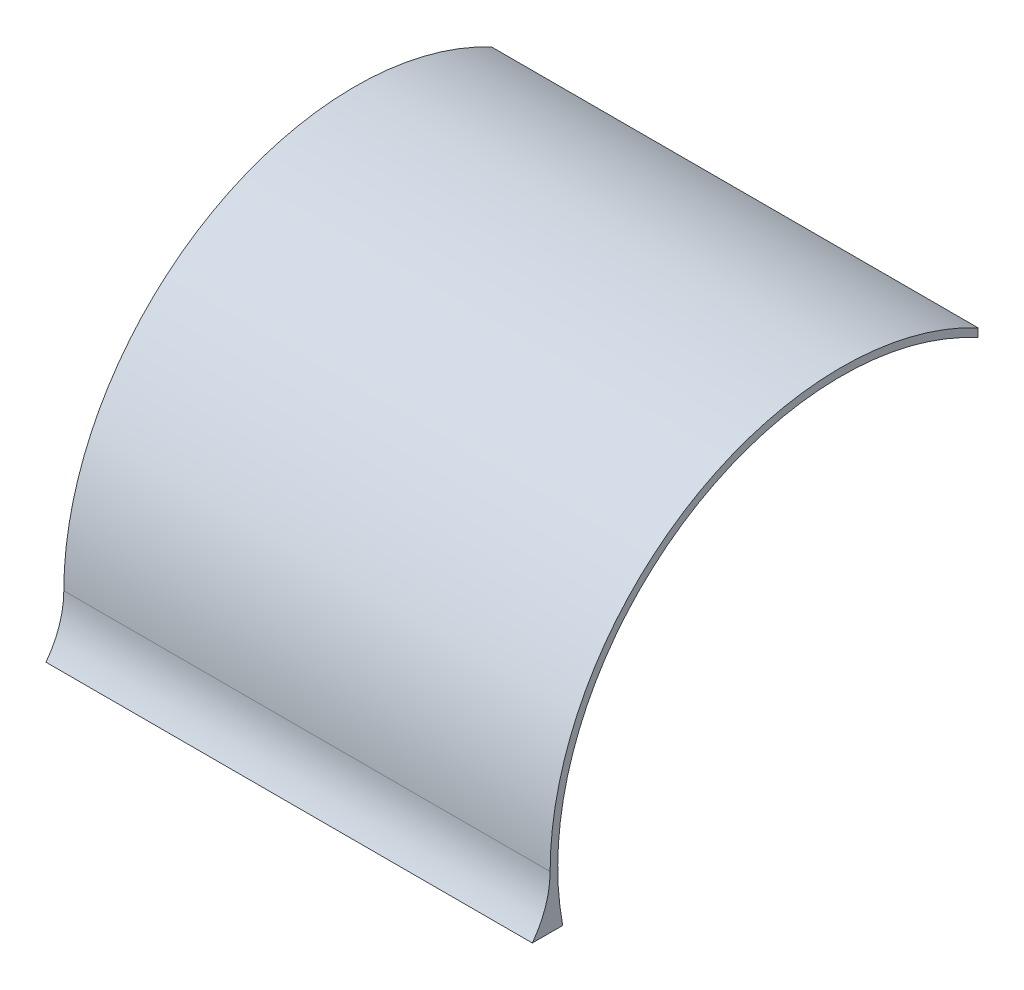
ISO-10303-21;
HEADER;
FILE_DESCRIPTION(('STEP AP214'),'2;1');
FILE_NAME('part.step','',(''),(''),'','','');
FILE_SCHEMA(('AUTOMOTIVE_DESIGN { 1 0 10303 214 1 1 1 1 }'));
ENDSEC;
DATA;
#1=APPLICATION_CONTEXT('core data for automotive mechanical design processes');
#2=APPLICATION_PROTOCOL_DEFINITION('international standard','automotive_design',2000,#1);
#3=PRODUCT_CONTEXT('',#1,'mechanical');
#4=PRODUCT('Part','Part','',(#3));
#5=PRODUCT_RELATED_PRODUCT_CATEGORY('part','',(#4));
#6=PRODUCT_DEFINITION_FORMATION('','',#4);
#7=PRODUCT_DEFINITION_CONTEXT('part definition',#1,'design');
#8=PRODUCT_DEFINITION('design','',#6,#7);
#9=PRODUCT_DEFINITION_SHAPE('','',#8);
#10=(LENGTH_UNIT() NAMED_UNIT(*) SI_UNIT(.MILLI.,.METRE.));
#11=(NAMED_UNIT(*) PLANE_ANGLE_UNIT() SI_UNIT($,.RADIAN.));
#12=(NAMED_UNIT(*) SI_UNIT($,.STERADIAN.) SOLID_ANGLE_UNIT());
#13=UNCERTAINTY_MEASURE_WITH_UNIT(LENGTH_MEASURE(1.E-05),#10,'distance_accuracy_value','');
#14=(GEOMETRIC_REPRESENTATION_CONTEXT(3) GLOBAL_UNCERTAINTY_ASSIGNED_CONTEXT((#13)) GLOBAL_UNIT_ASSIGNED_CONTEXT((#10,
#11,#12)) REPRESENTATION_CONTEXT('',''));
#15=CARTESIAN_POINT('',(0.,0.,0.));
#16=DIRECTION('',(0.,0.,1.));
#17=DIRECTION('',(1.,0.,0.));
#18=AXIS2_PLACEMENT_3D('',#15,#16,#17);
#19=CARTESIAN_POINT('',(160.,1.09833087701214E-13,-45.0000000000002));
#20=DIRECTION('',(0.,0.,-1.));
#21=DIRECTION('',(0.,1.,0.));
#22=AXIS2_PLACEMENT_3D('',#19,#20,#21);
#23=PLANE('',#22);
#24=DIRECTION('',(0.,-1.,0.));
#25=VECTOR('',#24,1.);
#26=CARTESIAN_POINT('',(0.,1.09833087701214E-13,-45.0000000000002));
#27=LINE('',#26,#25);
#28=CARTESIAN_POINT('',(0.,84.5392979625452,-45.));
#29=VERTEX_POINT('',#28);
#30=CARTESIAN_POINT('',(0.,81.6963456955083,-45.));
#31=VERTEX_POINT('',#30);
#32=EDGE_CURVE('E110',#29,#31,#27,.T.);
#33=ORIENTED_EDGE('',*,*,#32,.F.);
#34=DIRECTION('',(-1.,0.,0.));
#35=VECTOR('',#34,1.);
#36=CARTESIAN_POINT('',(160.,84.5392979625452,-45.));
#37=LINE('',#36,#35);
#38=CARTESIAN_POINT('',(160.,84.5392979625452,-45.));
#39=VERTEX_POINT('',#38);
#40=EDGE_CURVE('E11',#39,#29,#37,.T.);
#41=ORIENTED_EDGE('',*,*,#40,.F.);
#42=DIRECTION('',(0.,-1.,0.));
#43=VECTOR('',#42,1.);
#44=CARTESIAN_POINT('',(160.,1.09833087701214E-13,-45.0000000000002));
#45=LINE('',#44,#43);
#46=CARTESIAN_POINT('',(160.,81.6963456955083,-45.));
#47=VERTEX_POINT('',#46);
#48=EDGE_CURVE('E112',#39,#47,#45,.T.);
#49=ORIENTED_EDGE('',*,*,#48,.T.);
#50=DIRECTION('',(-1.,0.,0.));
#51=VECTOR('',#50,1.);
#52=CARTESIAN_POINT('',(160.,81.6963456955083,-45.));
#53=LINE('',#52,#51);
#54=EDGE_CURVE('E121',#47,#31,#53,.T.);
#55=ORIENTED_EDGE('',*,*,#54,.T.);
#56=EDGE_LOOP('',(#33,#41,#49,#55));
#57=FACE_BOUND('',#56,.T.);
#58=ADVANCED_FACE('F41',(#57),#23,.T.);
#59=CARTESIAN_POINT('',(160.,0.,0.));
#60=DIRECTION('',(-1.,0.,0.));
#61=DIRECTION('',(0.,0.,1.));
#62=AXIS2_PLACEMENT_3D('',#59,#60,#61);
#63=CYLINDRICAL_SURFACE('',#62,95.77);
#64=CARTESIAN_POINT('',(0.,0.,0.));
#65=DIRECTION('',(1.,0.,0.));
#66=DIRECTION('',(0.,0.,-1.));
#67=AXIS2_PLACEMENT_3D('',#64,#65,#66);
#68=CIRCLE('',#67,95.77);
#69=CARTESIAN_POINT('',(0.,0.,95.77));
#70=VERTEX_POINT('',#69);
#71=EDGE_CURVE('E59',#29,#70,#68,.T.);
#72=ORIENTED_EDGE('',*,*,#71,.T.);
#73=DIRECTION('',(1.,0.,0.));
#74=VECTOR('',#73,1.);
#75=CARTESIAN_POINT('',(0.,0.,95.77));
#76=LINE('',#75,#74);
#77=CARTESIAN_POINT('',(160.,0.,95.77));
#78=VERTEX_POINT('',#77);
#79=EDGE_CURVE('E55',#70,#78,#76,.T.);
#80=ORIENTED_EDGE('',*,*,#79,.T.);
#81=CARTESIAN_POINT('',(160.,0.,0.));
#82=DIRECTION('',(1.,0.,0.));
#83=DIRECTION('',(0.,0.,-1.));
#84=AXIS2_PLACEMENT_3D('',#81,#82,#83);
#85=CIRCLE('',#84,95.77);
#86=EDGE_CURVE('E115',#39,#78,#85,.T.);
#87=ORIENTED_EDGE('',*,*,#86,.F.);
#88=ORIENTED_EDGE('',*,*,#40,.T.);
#89=EDGE_LOOP('',(#72,#80,#87,#88));
#90=FACE_BOUND('',#89,.T.);
#91=ADVANCED_FACE('F131',(#90),#63,.T.);
#92=CARTESIAN_POINT('',(160.,-17.44,0.));
#93=DIRECTION('',(0.,1.,0.));
#94=DIRECTION('',(0.,0.,1.));
#95=AXIS2_PLACEMENT_3D('',#92,#93,#94);
#96=PLANE('',#95);
#97=DIRECTION('',(0.,0.,-1.));
#98=VECTOR('',#97,1.);
#99=CARTESIAN_POINT('',(0.,-17.44,0.));
#100=LINE('',#99,#98);
#101=CARTESIAN_POINT('',(0.,-17.44,101.62499276944));
#102=VERTEX_POINT('',#101);
#103=CARTESIAN_POINT('',(0.,-17.44,91.6249927694404));
#104=VERTEX_POINT('',#103);
#105=EDGE_CURVE('E86',#102,#104,#100,.T.);
#106=ORIENTED_EDGE('',*,*,#105,.T.);
#107=DIRECTION('',(-1.,0.,0.));
#108=VECTOR('',#107,1.);
#109=CARTESIAN_POINT('',(160.,-17.44,91.6249927694404));
#110=LINE('',#109,#108);
#111=CARTESIAN_POINT('',(160.,-17.44,91.6249927694404));
#112=VERTEX_POINT('',#111);
#113=EDGE_CURVE('E48',#112,#104,#110,.T.);
#114=ORIENTED_EDGE('',*,*,#113,.F.);
#115=DIRECTION('',(0.,0.,-1.));
#116=VECTOR('',#115,1.);
#117=CARTESIAN_POINT('',(160.,-17.44,0.));
#118=LINE('',#117,#116);
#119=CARTESIAN_POINT('',(160.,-17.44,101.62499276944));
#120=VERTEX_POINT('',#119);
#121=EDGE_CURVE('E100',#120,#112,#118,.T.);
#122=ORIENTED_EDGE('',*,*,#121,.F.);
#123=DIRECTION('',(1.,0.,0.));
#124=VECTOR('',#123,1.);
#125=CARTESIAN_POINT('',(0.,-17.44,101.62499276944));
#126=LINE('',#125,#124);
#127=EDGE_CURVE('E98',#102,#120,#126,.T.);
#128=ORIENTED_EDGE('',*,*,#127,.F.);
#129=EDGE_LOOP('',(#106,#114,#122,#128));
#130=FACE_BOUND('',#129,.T.);
#131=ADVANCED_FACE('F99',(#130),#96,.F.);
#132=CARTESIAN_POINT('',(160.,0.,0.));
#133=DIRECTION('',(-1.,0.,0.));
#134=DIRECTION('',(0.,0.,1.));
#135=AXIS2_PLACEMENT_3D('',#132,#133,#134);
#136=CYLINDRICAL_SURFACE('',#135,93.27);
#137=CARTESIAN_POINT('',(0.,0.,0.));
#138=DIRECTION('',(1.,0.,0.));
#139=DIRECTION('',(0.,0.,-1.));
#140=AXIS2_PLACEMENT_3D('',#137,#138,#139);
#141=CIRCLE('',#140,93.27);
#142=EDGE_CURVE('E93',#31,#104,#141,.T.);
#143=ORIENTED_EDGE('',*,*,#142,.F.);
#144=ORIENTED_EDGE('',*,*,#54,.F.);
#145=CARTESIAN_POINT('',(160.,0.,0.));
#146=DIRECTION('',(1.,0.,0.));
#147=DIRECTION('',(0.,0.,-1.));
#148=AXIS2_PLACEMENT_3D('',#145,#146,#147);
#149=CIRCLE('',#148,93.27);
#150=EDGE_CURVE('E118',#47,#112,#149,.T.);
#151=ORIENTED_EDGE('',*,*,#150,.T.);
#152=ORIENTED_EDGE('',*,*,#113,.T.);
#153=EDGE_LOOP('',(#143,#144,#151,#152));
#154=FACE_BOUND('',#153,.T.);
#155=ADVANCED_FACE('F126',(#154),#136,.F.);
#156=CARTESIAN_POINT('',(160.,0.,0.));
#157=DIRECTION('',(1.,0.,0.));
#158=DIRECTION('',(0.,0.,-1.));
#159=AXIS2_PLACEMENT_3D('',#156,#157,#158);
#160=PLANE('',#159);
#161=ORIENTED_EDGE('',*,*,#48,.F.);
#162=ORIENTED_EDGE('',*,*,#86,.T.);
#163=CARTESIAN_POINT('',(160.,7.10369263412503E-13,124.671362790459));
#164=DIRECTION('',(-1.,0.,0.));
#165=DIRECTION('',(0.,0.,1.));
#166=AXIS2_PLACEMENT_3D('',#163,#164,#165);
#167=CIRCLE('',#166,28.9013627904593);
#168=EDGE_CURVE('E106',#78,#120,#167,.T.);
#169=ORIENTED_EDGE('',*,*,#168,.T.);
#170=ORIENTED_EDGE('',*,*,#121,.T.);
#171=ORIENTED_EDGE('',*,*,#150,.F.);
#172=EDGE_LOOP('',(#161,#162,#169,#170,#171));
#173=FACE_BOUND('',#172,.T.);
#174=ADVANCED_FACE('F130',(#173),#160,.T.);
#175=CARTESIAN_POINT('',(0.,0.,0.));
#176=DIRECTION('',(1.,0.,0.));
#177=DIRECTION('',(0.,0.,-1.));
#178=AXIS2_PLACEMENT_3D('',#175,#176,#177);
#179=PLANE('',#178);
#180=ORIENTED_EDGE('',*,*,#32,.T.);
#181=ORIENTED_EDGE('',*,*,#142,.T.);
#182=ORIENTED_EDGE('',*,*,#105,.F.);
#183=CARTESIAN_POINT('',(0.,7.10369263412503E-13,124.671362790459));
#184=DIRECTION('',(-1.,0.,0.));
#185=DIRECTION('',(0.,0.,1.));
#186=AXIS2_PLACEMENT_3D('',#183,#184,#185);
#187=CIRCLE('',#186,28.9013627904593);
#188=EDGE_CURVE('E91',#70,#102,#187,.T.);
#189=ORIENTED_EDGE('',*,*,#188,.F.);
#190=ORIENTED_EDGE('',*,*,#71,.F.);
#191=EDGE_LOOP('',(#180,#181,#182,#189,#190));
#192=FACE_BOUND('',#191,.T.);
#193=ADVANCED_FACE('F89',(#192),#179,.F.);
#194=CARTESIAN_POINT('',(0.,7.10369263412503E-13,124.671362790459));
#195=DIRECTION('',(1.,0.,0.));
#196=DIRECTION('',(0.,0.,-1.));
#197=AXIS2_PLACEMENT_3D('',#194,#195,#196);
#198=CYLINDRICAL_SURFACE('',#197,28.9013627904593);
#199=ORIENTED_EDGE('',*,*,#168,.F.);
#200=ORIENTED_EDGE('',*,*,#79,.F.);
#201=ORIENTED_EDGE('',*,*,#188,.T.);
#202=ORIENTED_EDGE('',*,*,#127,.T.);
#203=EDGE_LOOP('',(#199,#200,#201,#202));
#204=FACE_BOUND('',#203,.T.);
#205=ADVANCED_FACE('F105',(#204),#198,.F.);
#206=CLOSED_SHELL('',(#58,#91,#131,#155,#174,#193,#205));
#207=MANIFOLD_SOLID_BREP('B2',#206);
#208=ADVANCED_BREP_SHAPE_REPRESENTATION('',(#18,#207),#14);
#209=SHAPE_DEFINITION_REPRESENTATION(#9,#208);
ENDSEC;
END-ISO-10303-21;
